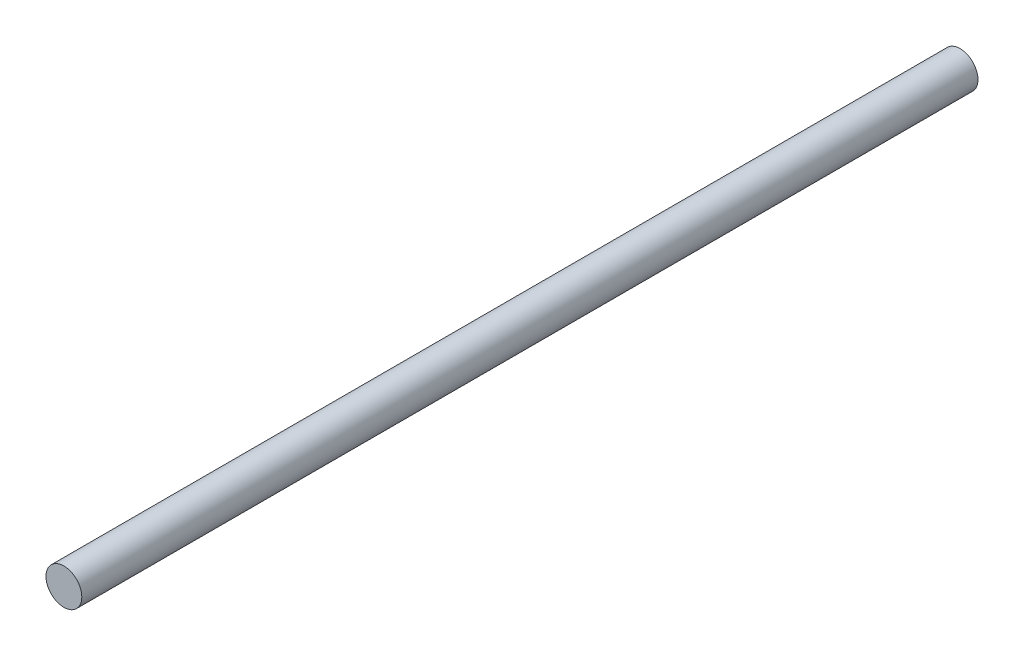
ISO-10303-21;
HEADER;
FILE_DESCRIPTION(('STEP AP214'),'2;1');
FILE_NAME('part.step','',(''),(''),'','','');
FILE_SCHEMA(('AUTOMOTIVE_DESIGN { 1 0 10303 214 1 1 1 1 }'));
ENDSEC;
DATA;
#1=APPLICATION_CONTEXT('core data for automotive mechanical design processes');
#2=APPLICATION_PROTOCOL_DEFINITION('international standard','automotive_design',2000,#1);
#3=PRODUCT_CONTEXT('',#1,'mechanical');
#4=PRODUCT('Part','Part','',(#3));
#5=PRODUCT_RELATED_PRODUCT_CATEGORY('part','',(#4));
#6=PRODUCT_DEFINITION_FORMATION('','',#4);
#7=PRODUCT_DEFINITION_CONTEXT('part definition',#1,'design');
#8=PRODUCT_DEFINITION('design','',#6,#7);
#9=PRODUCT_DEFINITION_SHAPE('','',#8);
#10=(LENGTH_UNIT() NAMED_UNIT(*) SI_UNIT(.MILLI.,.METRE.));
#11=(NAMED_UNIT(*) PLANE_ANGLE_UNIT() SI_UNIT($,.RADIAN.));
#12=(NAMED_UNIT(*) SI_UNIT($,.STERADIAN.) SOLID_ANGLE_UNIT());
#13=UNCERTAINTY_MEASURE_WITH_UNIT(LENGTH_MEASURE(1.E-05),#10,'distance_accuracy_value','');
#14=(GEOMETRIC_REPRESENTATION_CONTEXT(3) GLOBAL_UNCERTAINTY_ASSIGNED_CONTEXT((#13)) GLOBAL_UNIT_ASSIGNED_CONTEXT((#10,
#11,#12)) REPRESENTATION_CONTEXT('',''));
#15=CARTESIAN_POINT('',(0.,0.,0.));
#16=DIRECTION('',(0.,0.,1.));
#17=DIRECTION('',(1.,0.,0.));
#18=AXIS2_PLACEMENT_3D('',#15,#16,#17);
#19=CARTESIAN_POINT('',(0.,0.,100.));
#20=DIRECTION('',(0.,0.,-1.));
#21=DIRECTION('',(-1.,0.,0.));
#22=AXIS2_PLACEMENT_3D('',#19,#20,#21);
#23=CYLINDRICAL_SURFACE('',#22,2.);
#24=CARTESIAN_POINT('',(0.,0.,100.));
#25=DIRECTION('',(0.,0.,1.));
#26=DIRECTION('',(1.,0.,0.));
#27=AXIS2_PLACEMENT_3D('',#24,#25,#26);
#28=CIRCLE('',#27,2.);
#29=CARTESIAN_POINT('',(2.,0.,100.));
#30=VERTEX_POINT('',#29);
#31=EDGE_CURVE('E10',#30,#30,#28,.T.);
#32=ORIENTED_EDGE('',*,*,#31,.F.);
#33=EDGE_LOOP('',(#32));
#34=FACE_BOUND('',#33,.T.);
#35=CARTESIAN_POINT('',(0.,0.,0.));
#36=DIRECTION('',(0.,0.,1.));
#37=DIRECTION('',(1.,0.,0.));
#38=AXIS2_PLACEMENT_3D('',#35,#36,#37);
#39=CIRCLE('',#38,2.);
#40=CARTESIAN_POINT('',(2.,0.,0.));
#41=VERTEX_POINT('',#40);
#42=EDGE_CURVE('E34',#41,#41,#39,.T.);
#43=ORIENTED_EDGE('',*,*,#42,.T.);
#44=EDGE_LOOP('',(#43));
#45=FACE_BOUND('',#44,.T.);
#46=ADVANCED_FACE('F31',(#34,#45),#23,.T.);
#47=CARTESIAN_POINT('',(0.,0.,100.));
#48=DIRECTION('',(0.,0.,1.));
#49=DIRECTION('',(1.,0.,0.));
#50=AXIS2_PLACEMENT_3D('',#47,#48,#49);
#51=PLANE('',#50);
#52=ORIENTED_EDGE('',*,*,#31,.T.);
#53=EDGE_LOOP('',(#52));
#54=FACE_BOUND('',#53,.T.);
#55=ADVANCED_FACE('F46',(#54),#51,.T.);
#56=CARTESIAN_POINT('',(0.,0.,0.));
#57=DIRECTION('',(0.,0.,1.));
#58=DIRECTION('',(1.,0.,0.));
#59=AXIS2_PLACEMENT_3D('',#56,#57,#58);
#60=PLANE('',#59);
#61=ORIENTED_EDGE('',*,*,#42,.F.);
#62=EDGE_LOOP('',(#61));
#63=FACE_BOUND('',#62,.T.);
#64=ADVANCED_FACE('F44',(#63),#60,.F.);
#65=CLOSED_SHELL('',(#46,#55,#64));
#66=MANIFOLD_SOLID_BREP('B2',#65);
#67=ADVANCED_BREP_SHAPE_REPRESENTATION('',(#18,#66),#14);
#68=SHAPE_DEFINITION_REPRESENTATION(#9,#67);
ENDSEC;
END-ISO-10303-21;
